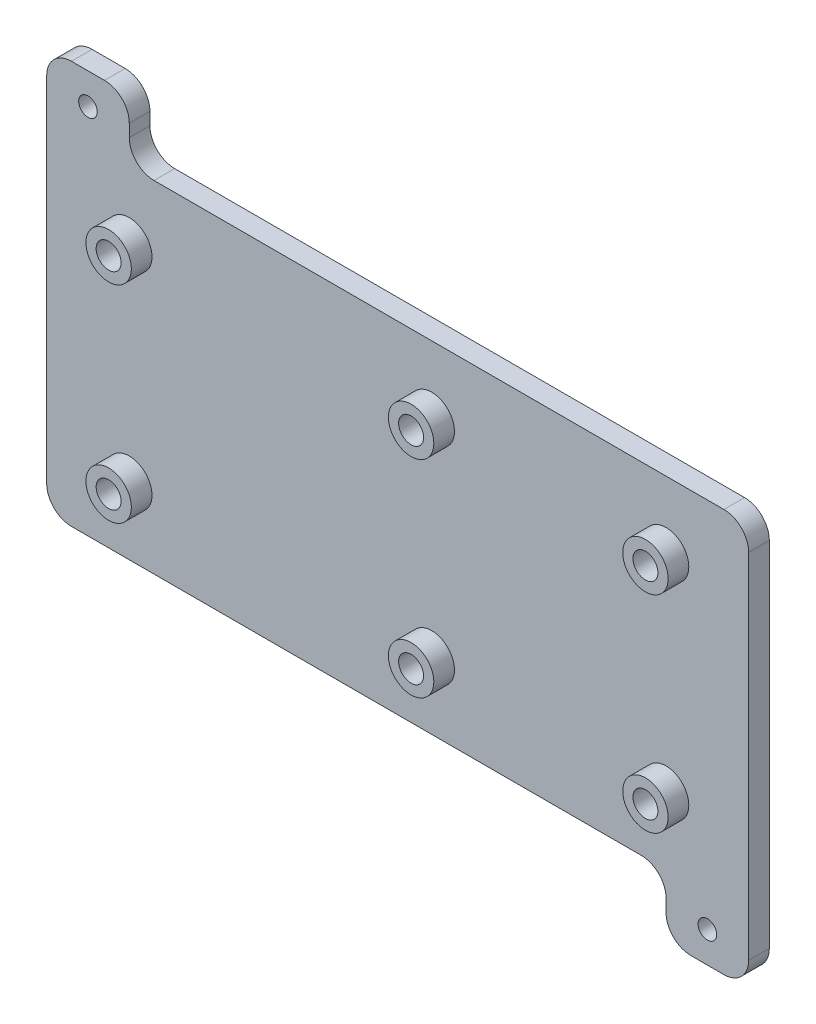
ISO-10303-21;
HEADER;
FILE_DESCRIPTION(('STEP AP214'),'2;1');
FILE_NAME('part.step','',(''),(''),'','','');
FILE_SCHEMA(('AUTOMOTIVE_DESIGN { 1 0 10303 214 1 1 1 1 }'));
ENDSEC;
DATA;
#1=APPLICATION_CONTEXT('core data for automotive mechanical design processes');
#2=APPLICATION_PROTOCOL_DEFINITION('international standard','automotive_design',2000,#1);
#3=PRODUCT_CONTEXT('',#1,'mechanical');
#4=PRODUCT('Part','Part','',(#3));
#5=PRODUCT_RELATED_PRODUCT_CATEGORY('part','',(#4));
#6=PRODUCT_DEFINITION_FORMATION('','',#4);
#7=PRODUCT_DEFINITION_CONTEXT('part definition',#1,'design');
#8=PRODUCT_DEFINITION('design','',#6,#7);
#9=PRODUCT_DEFINITION_SHAPE('','',#8);
#10=(LENGTH_UNIT() NAMED_UNIT(*) SI_UNIT(.MILLI.,.METRE.));
#11=(NAMED_UNIT(*) PLANE_ANGLE_UNIT() SI_UNIT($,.RADIAN.));
#12=(NAMED_UNIT(*) SI_UNIT($,.STERADIAN.) SOLID_ANGLE_UNIT());
#13=UNCERTAINTY_MEASURE_WITH_UNIT(LENGTH_MEASURE(1.E-05),#10,'distance_accuracy_value','');
#14=(GEOMETRIC_REPRESENTATION_CONTEXT(3) GLOBAL_UNCERTAINTY_ASSIGNED_CONTEXT((#13)) GLOBAL_UNIT_ASSIGNED_CONTEXT((#10,
#11,#12)) REPRESENTATION_CONTEXT('',''));
#15=CARTESIAN_POINT('',(0.,0.,0.));
#16=DIRECTION('',(0.,0.,1.));
#17=DIRECTION('',(1.,0.,0.));
#18=AXIS2_PLACEMENT_3D('',#15,#16,#17);
#19=CARTESIAN_POINT('',(85.,41.275,5.));
#20=DIRECTION('',(-1.,0.,0.));
#21=DIRECTION('',(0.,-1.,0.));
#22=AXIS2_PLACEMENT_3D('',#19,#20,#21);
#23=PLANE('',#22);
#24=DIRECTION('',(0.,1.,0.));
#25=VECTOR('',#24,1.);
#26=CARTESIAN_POINT('',(85.,41.275,5.));
#27=LINE('',#26,#25);
#28=CARTESIAN_POINT('',(85.,-50.275,5.));
#29=VERTEX_POINT('',#28);
#30=CARTESIAN_POINT('',(85.,35.275,5.));
#31=VERTEX_POINT('',#30);
#32=EDGE_CURVE('E178',#29,#31,#27,.T.);
#33=ORIENTED_EDGE('',*,*,#32,.F.);
#34=DIRECTION('',(0.,0.,1.));
#35=VECTOR('',#34,1.);
#36=CARTESIAN_POINT('',(85.,-50.275,5.));
#37=LINE('',#36,#35);
#38=CARTESIAN_POINT('',(85.,-50.275,0.));
#39=VERTEX_POINT('',#38);
#40=EDGE_CURVE('E237',#29,#39,#37,.F.);
#41=ORIENTED_EDGE('',*,*,#40,.T.);
#42=DIRECTION('',(0.,1.,0.));
#43=VECTOR('',#42,1.);
#44=CARTESIAN_POINT('',(85.,41.275,0.));
#45=LINE('',#44,#43);
#46=CARTESIAN_POINT('',(85.,35.275,0.));
#47=VERTEX_POINT('',#46);
#48=EDGE_CURVE('E280',#39,#47,#45,.T.);
#49=ORIENTED_EDGE('',*,*,#48,.T.);
#50=DIRECTION('',(0.,0.,-1.));
#51=VECTOR('',#50,1.);
#52=CARTESIAN_POINT('',(85.,35.275,5.));
#53=LINE('',#52,#51);
#54=EDGE_CURVE('E235',#47,#31,#53,.F.);
#55=ORIENTED_EDGE('',*,*,#54,.T.);
#56=EDGE_LOOP('',(#33,#41,#49,#55));
#57=FACE_BOUND('',#56,.T.);
#58=ADVANCED_FACE('F36',(#57),#23,.F.);
#59=CARTESIAN_POINT('',(-85.,41.275,5.));
#60=DIRECTION('',(0.,-1.,0.));
#61=DIRECTION('',(0.,0.,-1.));
#62=AXIS2_PLACEMENT_3D('',#59,#60,#61);
#63=PLANE('',#62);
#64=DIRECTION('',(-1.,0.,0.));
#65=VECTOR('',#64,1.);
#66=CARTESIAN_POINT('',(-85.,41.275,5.));
#67=LINE('',#66,#65);
#68=CARTESIAN_POINT('',(79.,41.275,5.));
#69=VERTEX_POINT('',#68);
#70=CARTESIAN_POINT('',(-59.,41.275,5.));
#71=VERTEX_POINT('',#70);
#72=EDGE_CURVE('E182',#69,#71,#67,.T.);
#73=ORIENTED_EDGE('',*,*,#72,.F.);
#74=DIRECTION('',(0.,0.,-1.));
#75=VECTOR('',#74,1.);
#76=CARTESIAN_POINT('',(79.,41.275,5.));
#77=LINE('',#76,#75);
#78=CARTESIAN_POINT('',(79.,41.275,0.));
#79=VERTEX_POINT('',#78);
#80=EDGE_CURVE('E242',#69,#79,#77,.T.);
#81=ORIENTED_EDGE('',*,*,#80,.T.);
#82=DIRECTION('',(-1.,0.,0.));
#83=VECTOR('',#82,1.);
#84=CARTESIAN_POINT('',(-85.,41.275,0.));
#85=LINE('',#84,#83);
#86=CARTESIAN_POINT('',(-59.,41.275,0.));
#87=VERTEX_POINT('',#86);
#88=EDGE_CURVE('E184',#79,#87,#85,.T.);
#89=ORIENTED_EDGE('',*,*,#88,.T.);
#90=DIRECTION('',(0.,0.,1.));
#91=VECTOR('',#90,1.);
#92=CARTESIAN_POINT('',(-59.,41.275,5.));
#93=LINE('',#92,#91);
#94=EDGE_CURVE('E239',#87,#71,#93,.T.);
#95=ORIENTED_EDGE('',*,*,#94,.T.);
#96=EDGE_LOOP('',(#73,#81,#89,#95));
#97=FACE_BOUND('',#96,.T.);
#98=ADVANCED_FACE('F279',(#97),#63,.F.);
#99=CARTESIAN_POINT('',(-85.,41.275,5.));
#100=DIRECTION('',(1.,0.,0.));
#101=DIRECTION('',(0.,1.,0.));
#102=AXIS2_PLACEMENT_3D('',#99,#100,#101);
#103=PLANE('',#102);
#104=DIRECTION('',(0.,-1.,0.));
#105=VECTOR('',#104,1.);
#106=CARTESIAN_POINT('',(-85.,41.275,5.));
#107=LINE('',#106,#105);
#108=CARTESIAN_POINT('',(-85.,50.275,5.));
#109=VERTEX_POINT('',#108);
#110=CARTESIAN_POINT('',(-85.,-35.275,5.));
#111=VERTEX_POINT('',#110);
#112=EDGE_CURVE('E286',#109,#111,#107,.T.);
#113=ORIENTED_EDGE('',*,*,#112,.F.);
#114=DIRECTION('',(0.,0.,1.));
#115=VECTOR('',#114,1.);
#116=CARTESIAN_POINT('',(-85.,50.275,5.));
#117=LINE('',#116,#115);
#118=CARTESIAN_POINT('',(-85.,50.275,0.));
#119=VERTEX_POINT('',#118);
#120=EDGE_CURVE('E255',#109,#119,#117,.F.);
#121=ORIENTED_EDGE('',*,*,#120,.T.);
#122=DIRECTION('',(0.,-1.,0.));
#123=VECTOR('',#122,1.);
#124=CARTESIAN_POINT('',(-85.,41.275,0.));
#125=LINE('',#124,#123);
#126=CARTESIAN_POINT('',(-85.,-35.275,0.));
#127=VERTEX_POINT('',#126);
#128=EDGE_CURVE('E179',#119,#127,#125,.T.);
#129=ORIENTED_EDGE('',*,*,#128,.T.);
#130=DIRECTION('',(0.,0.,-1.));
#131=VECTOR('',#130,1.);
#132=CARTESIAN_POINT('',(-85.,-35.275,5.));
#133=LINE('',#132,#131);
#134=EDGE_CURVE('E154',#127,#111,#133,.F.);
#135=ORIENTED_EDGE('',*,*,#134,.T.);
#136=EDGE_LOOP('',(#113,#121,#129,#135));
#137=FACE_BOUND('',#136,.T.);
#138=ADVANCED_FACE('F414',(#137),#103,.F.);
#139=CARTESIAN_POINT('',(-85.,-41.275,5.));
#140=DIRECTION('',(0.,1.,0.));
#141=DIRECTION('',(0.,0.,1.));
#142=AXIS2_PLACEMENT_3D('',#139,#140,#141);
#143=PLANE('',#142);
#144=DIRECTION('',(1.,0.,0.));
#145=VECTOR('',#144,1.);
#146=CARTESIAN_POINT('',(-85.,-41.275,0.));
#147=LINE('',#146,#145);
#148=CARTESIAN_POINT('',(-79.,-41.275,0.));
#149=VERTEX_POINT('',#148);
#150=CARTESIAN_POINT('',(59.,-41.275,0.));
#151=VERTEX_POINT('',#150);
#152=EDGE_CURVE('E166',#149,#151,#147,.T.);
#153=ORIENTED_EDGE('',*,*,#152,.T.);
#154=DIRECTION('',(0.,0.,1.));
#155=VECTOR('',#154,1.);
#156=CARTESIAN_POINT('',(59.,-41.275,5.));
#157=LINE('',#156,#155);
#158=CARTESIAN_POINT('',(59.,-41.275,5.));
#159=VERTEX_POINT('',#158);
#160=EDGE_CURVE('E170',#151,#159,#157,.T.);
#161=ORIENTED_EDGE('',*,*,#160,.T.);
#162=DIRECTION('',(1.,0.,0.));
#163=VECTOR('',#162,1.);
#164=CARTESIAN_POINT('',(-85.,-41.275,5.));
#165=LINE('',#164,#163);
#166=CARTESIAN_POINT('',(-79.,-41.275,5.));
#167=VERTEX_POINT('',#166);
#168=EDGE_CURVE('E169',#167,#159,#165,.T.);
#169=ORIENTED_EDGE('',*,*,#168,.F.);
#170=DIRECTION('',(0.,0.,-1.));
#171=VECTOR('',#170,1.);
#172=CARTESIAN_POINT('',(-79.,-41.275,5.));
#173=LINE('',#172,#171);
#174=EDGE_CURVE('E153',#167,#149,#173,.T.);
#175=ORIENTED_EDGE('',*,*,#174,.T.);
#176=EDGE_LOOP('',(#153,#161,#169,#175));
#177=FACE_BOUND('',#176,.T.);
#178=ADVANCED_FACE('F164',(#177),#143,.F.);
#179=CARTESIAN_POINT('',(0.,0.,5.));
#180=DIRECTION('',(0.,0.,1.));
#181=DIRECTION('',(1.,0.,0.));
#182=AXIS2_PLACEMENT_3D('',#179,#180,#181);
#183=PLANE('',#182);
#184=CARTESIAN_POINT('',(-75.,48.775,5.));
#185=DIRECTION('',(0.,0.,1.));
#186=DIRECTION('',(1.,0.,0.));
#187=AXIS2_PLACEMENT_3D('',#184,#185,#186);
#188=CIRCLE('',#187,2.24999999999999);
#189=CARTESIAN_POINT('',(-72.75,48.775,5.));
#190=VERTEX_POINT('',#189);
#191=EDGE_CURVE('E368',#190,#190,#188,.T.);
#192=ORIENTED_EDGE('',*,*,#191,.F.);
#193=EDGE_LOOP('',(#192));
#194=FACE_BOUND('',#193,.T.);
#195=CARTESIAN_POINT('',(75.,-48.775,5.));
#196=DIRECTION('',(0.,0.,1.));
#197=DIRECTION('',(1.,0.,0.));
#198=AXIS2_PLACEMENT_3D('',#195,#196,#197);
#199=CIRCLE('',#198,2.24999999999999);
#200=CARTESIAN_POINT('',(77.25,-48.775,5.));
#201=VERTEX_POINT('',#200);
#202=EDGE_CURVE('E362',#201,#201,#199,.T.);
#203=ORIENTED_EDGE('',*,*,#202,.F.);
#204=EDGE_LOOP('',(#203));
#205=FACE_BOUND('',#204,.T.);
#206=CARTESIAN_POINT('',(65.0000000000003,-25.,5.));
#207=DIRECTION('',(0.,0.,1.));
#208=DIRECTION('',(1.,0.,0.));
#209=AXIS2_PLACEMENT_3D('',#206,#207,#208);
#210=CIRCLE('',#209,5.49999999999954);
#211=CARTESIAN_POINT('',(70.4999999999999,-25.,5.));
#212=VERTEX_POINT('',#211);
#213=EDGE_CURVE('E335',#212,#212,#210,.T.);
#214=ORIENTED_EDGE('',*,*,#213,.F.);
#215=EDGE_LOOP('',(#214));
#216=FACE_BOUND('',#215,.T.);
#217=CARTESIAN_POINT('',(8.25000000000034,-25.,5.));
#218=DIRECTION('',(0.,0.,1.));
#219=DIRECTION('',(1.,0.,0.));
#220=AXIS2_PLACEMENT_3D('',#217,#218,#219);
#221=CIRCLE('',#220,5.49999999999953);
#222=CARTESIAN_POINT('',(13.7499999999999,-25.,5.));
#223=VERTEX_POINT('',#222);
#224=EDGE_CURVE('E326',#223,#223,#221,.T.);
#225=ORIENTED_EDGE('',*,*,#224,.F.);
#226=EDGE_LOOP('',(#225));
#227=FACE_BOUND('',#226,.T.);
#228=CARTESIAN_POINT('',(-64.9999999999997,-25.,5.));
#229=DIRECTION('',(0.,0.,1.));
#230=DIRECTION('',(1.,0.,0.));
#231=AXIS2_PLACEMENT_3D('',#228,#229,#230);
#232=CIRCLE('',#231,5.49999999999953);
#233=CARTESIAN_POINT('',(-59.5000000000002,-25.,5.));
#234=VERTEX_POINT('',#233);
#235=EDGE_CURVE('E317',#234,#234,#232,.T.);
#236=ORIENTED_EDGE('',*,*,#235,.F.);
#237=EDGE_LOOP('',(#236));
#238=FACE_BOUND('',#237,.T.);
#239=CARTESIAN_POINT('',(-64.9999999999997,25.,5.));
#240=DIRECTION('',(0.,0.,1.));
#241=DIRECTION('',(1.,0.,0.));
#242=AXIS2_PLACEMENT_3D('',#239,#240,#241);
#243=CIRCLE('',#242,5.49999999999952);
#244=CARTESIAN_POINT('',(-59.5000000000002,25.,5.));
#245=VERTEX_POINT('',#244);
#246=EDGE_CURVE('E308',#245,#245,#243,.T.);
#247=ORIENTED_EDGE('',*,*,#246,.F.);
#248=EDGE_LOOP('',(#247));
#249=FACE_BOUND('',#248,.T.);
#250=CARTESIAN_POINT('',(8.2500000000003,25.,5.));
#251=DIRECTION('',(0.,0.,1.));
#252=DIRECTION('',(1.,0.,0.));
#253=AXIS2_PLACEMENT_3D('',#250,#251,#252);
#254=CIRCLE('',#253,5.49999999999953);
#255=CARTESIAN_POINT('',(13.7499999999998,25.,5.));
#256=VERTEX_POINT('',#255);
#257=EDGE_CURVE('E299',#256,#256,#254,.T.);
#258=ORIENTED_EDGE('',*,*,#257,.F.);
#259=EDGE_LOOP('',(#258));
#260=FACE_BOUND('',#259,.T.);
#261=CARTESIAN_POINT('',(65.0000000000003,25.,5.));
#262=DIRECTION('',(0.,0.,1.));
#263=DIRECTION('',(1.,0.,0.));
#264=AXIS2_PLACEMENT_3D('',#261,#262,#263);
#265=CIRCLE('',#264,5.49999999999954);
#266=CARTESIAN_POINT('',(70.4999999999998,25.,5.));
#267=VERTEX_POINT('',#266);
#268=EDGE_CURVE('E290',#267,#267,#265,.T.);
#269=ORIENTED_EDGE('',*,*,#268,.F.);
#270=EDGE_LOOP('',(#269));
#271=FACE_BOUND('',#270,.T.);
#272=DIRECTION('',(0.,-1.,0.));
#273=VECTOR('',#272,1.);
#274=CARTESIAN_POINT('',(65.,0.,5.));
#275=LINE('',#274,#273);
#276=CARTESIAN_POINT('',(65.,-47.275,5.));
#277=VERTEX_POINT('',#276);
#278=CARTESIAN_POINT('',(65.,-50.275,5.));
#279=VERTEX_POINT('',#278);
#280=EDGE_CURVE('E354',#277,#279,#275,.T.);
#281=ORIENTED_EDGE('',*,*,#280,.T.);
#282=CARTESIAN_POINT('',(71.,-50.275,5.));
#283=DIRECTION('',(0.,0.,1.));
#284=DIRECTION('',(1.,0.,0.));
#285=AXIS2_PLACEMENT_3D('',#282,#283,#284);
#286=CIRCLE('',#285,6.);
#287=CARTESIAN_POINT('',(71.,-56.275,5.));
#288=VERTEX_POINT('',#287);
#289=EDGE_CURVE('E221',#279,#288,#286,.T.);
#290=ORIENTED_EDGE('',*,*,#289,.T.);
#291=DIRECTION('',(-1.,0.,0.));
#292=VECTOR('',#291,1.);
#293=CARTESIAN_POINT('',(0.,-56.275,5.));
#294=LINE('',#293,#292);
#295=CARTESIAN_POINT('',(79.,-56.275,5.));
#296=VERTEX_POINT('',#295);
#297=EDGE_CURVE('E350',#296,#288,#294,.T.);
#298=ORIENTED_EDGE('',*,*,#297,.F.);
#299=CARTESIAN_POINT('',(79.,-50.275,5.));
#300=DIRECTION('',(0.,0.,1.));
#301=DIRECTION('',(1.,0.,0.));
#302=AXIS2_PLACEMENT_3D('',#299,#300,#301);
#303=CIRCLE('',#302,6.);
#304=EDGE_CURVE('E219',#296,#29,#303,.T.);
#305=ORIENTED_EDGE('',*,*,#304,.T.);
#306=ORIENTED_EDGE('',*,*,#32,.T.);
#307=CARTESIAN_POINT('',(79.,35.275,5.));
#308=DIRECTION('',(0.,0.,1.));
#309=DIRECTION('',(1.,0.,0.));
#310=AXIS2_PLACEMENT_3D('',#307,#308,#309);
#311=CIRCLE('',#310,6.);
#312=EDGE_CURVE('E217',#31,#69,#311,.T.);
#313=ORIENTED_EDGE('',*,*,#312,.T.);
#314=ORIENTED_EDGE('',*,*,#72,.T.);
#315=CARTESIAN_POINT('',(-59.,47.275,5.));
#316=DIRECTION('',(0.,0.,1.));
#317=DIRECTION('',(1.,0.,0.));
#318=AXIS2_PLACEMENT_3D('',#315,#316,#317);
#319=CIRCLE('',#318,6.);
#320=CARTESIAN_POINT('',(-65.,47.275,5.));
#321=VERTEX_POINT('',#320);
#322=EDGE_CURVE('E44',#71,#321,#319,.F.);
#323=ORIENTED_EDGE('',*,*,#322,.T.);
#324=DIRECTION('',(0.,1.,0.));
#325=VECTOR('',#324,1.);
#326=CARTESIAN_POINT('',(-65.,0.,5.));
#327=LINE('',#326,#325);
#328=CARTESIAN_POINT('',(-65.,50.275,5.));
#329=VERTEX_POINT('',#328);
#330=EDGE_CURVE('E265',#321,#329,#327,.T.);
#331=ORIENTED_EDGE('',*,*,#330,.T.);
#332=CARTESIAN_POINT('',(-71.,50.275,5.));
#333=DIRECTION('',(0.,0.,1.));
#334=DIRECTION('',(1.,0.,0.));
#335=AXIS2_PLACEMENT_3D('',#332,#333,#334);
#336=CIRCLE('',#335,6.);
#337=CARTESIAN_POINT('',(-71.,56.275,5.));
#338=VERTEX_POINT('',#337);
#339=EDGE_CURVE('E215',#329,#338,#336,.T.);
#340=ORIENTED_EDGE('',*,*,#339,.T.);
#341=DIRECTION('',(1.,0.,0.));
#342=VECTOR('',#341,1.);
#343=CARTESIAN_POINT('',(0.,56.275,5.));
#344=LINE('',#343,#342);
#345=CARTESIAN_POINT('',(-79.,56.275,5.));
#346=VERTEX_POINT('',#345);
#347=EDGE_CURVE('E274',#346,#338,#344,.T.);
#348=ORIENTED_EDGE('',*,*,#347,.F.);
#349=CARTESIAN_POINT('',(-79.,50.275,5.));
#350=DIRECTION('',(0.,0.,1.));
#351=DIRECTION('',(1.,0.,0.));
#352=AXIS2_PLACEMENT_3D('',#349,#350,#351);
#353=CIRCLE('',#352,6.);
#354=EDGE_CURVE('E213',#346,#109,#353,.T.);
#355=ORIENTED_EDGE('',*,*,#354,.T.);
#356=ORIENTED_EDGE('',*,*,#112,.T.);
#357=CARTESIAN_POINT('',(-79.,-35.275,5.));
#358=DIRECTION('',(0.,0.,1.));
#359=DIRECTION('',(1.,0.,0.));
#360=AXIS2_PLACEMENT_3D('',#357,#358,#359);
#361=CIRCLE('',#360,6.);
#362=EDGE_CURVE('E211',#111,#167,#361,.T.);
#363=ORIENTED_EDGE('',*,*,#362,.T.);
#364=ORIENTED_EDGE('',*,*,#168,.T.);
#365=CARTESIAN_POINT('',(59.,-47.275,5.));
#366=DIRECTION('',(0.,0.,1.));
#367=DIRECTION('',(1.,0.,0.));
#368=AXIS2_PLACEMENT_3D('',#365,#366,#367);
#369=CIRCLE('',#368,6.);
#370=EDGE_CURVE('E257',#159,#277,#369,.F.);
#371=ORIENTED_EDGE('',*,*,#370,.T.);
#372=EDGE_LOOP('',(#281,#290,#298,#305,#306,#313,#314,#323,#331,#340,#348,#355,#356,#363,#364,#371));
#373=FACE_BOUND('',#372,.T.);
#374=ADVANCED_FACE('F264',(#194,#205,#216,#227,#238,#249,#260,#271,#373),#183,.T.);
#375=CARTESIAN_POINT('',(0.,0.,0.));
#376=DIRECTION('',(0.,0.,1.));
#377=DIRECTION('',(1.,0.,0.));
#378=AXIS2_PLACEMENT_3D('',#375,#376,#377);
#379=PLANE('',#378);
#380=CARTESIAN_POINT('',(-75.,48.775,0.));
#381=DIRECTION('',(0.,0.,1.));
#382=DIRECTION('',(1.,0.,0.));
#383=AXIS2_PLACEMENT_3D('',#380,#381,#382);
#384=CIRCLE('',#383,2.24999999999999);
#385=CARTESIAN_POINT('',(-72.75,48.775,0.));
#386=VERTEX_POINT('',#385);
#387=EDGE_CURVE('E365',#386,#386,#384,.T.);
#388=ORIENTED_EDGE('',*,*,#387,.T.);
#389=EDGE_LOOP('',(#388));
#390=FACE_BOUND('',#389,.T.);
#391=CARTESIAN_POINT('',(75.,-48.775,0.));
#392=DIRECTION('',(0.,0.,1.));
#393=DIRECTION('',(1.,0.,0.));
#394=AXIS2_PLACEMENT_3D('',#391,#392,#393);
#395=CIRCLE('',#394,2.24999999999999);
#396=CARTESIAN_POINT('',(77.25,-48.775,0.));
#397=VERTEX_POINT('',#396);
#398=EDGE_CURVE('E356',#397,#397,#395,.T.);
#399=ORIENTED_EDGE('',*,*,#398,.T.);
#400=EDGE_LOOP('',(#399));
#401=FACE_BOUND('',#400,.T.);
#402=DIRECTION('',(-1.,0.,0.));
#403=VECTOR('',#402,1.);
#404=CARTESIAN_POINT('',(0.,-56.275,0.));
#405=LINE('',#404,#403);
#406=CARTESIAN_POINT('',(79.,-56.275,0.));
#407=VERTEX_POINT('',#406);
#408=CARTESIAN_POINT('',(71.,-56.275,0.));
#409=VERTEX_POINT('',#408);
#410=EDGE_CURVE('E275',#407,#409,#405,.T.);
#411=ORIENTED_EDGE('',*,*,#410,.T.);
#412=CARTESIAN_POINT('',(71.,-50.275,0.));
#413=DIRECTION('',(0.,0.,1.));
#414=DIRECTION('',(1.,0.,0.));
#415=AXIS2_PLACEMENT_3D('',#412,#413,#414);
#416=CIRCLE('',#415,6.);
#417=CARTESIAN_POINT('',(65.,-50.275,0.));
#418=VERTEX_POINT('',#417);
#419=EDGE_CURVE('E233',#409,#418,#416,.F.);
#420=ORIENTED_EDGE('',*,*,#419,.T.);
#421=DIRECTION('',(0.,-1.,0.));
#422=VECTOR('',#421,1.);
#423=CARTESIAN_POINT('',(65.,0.,0.));
#424=LINE('',#423,#422);
#425=CARTESIAN_POINT('',(65.,-47.275,0.));
#426=VERTEX_POINT('',#425);
#427=EDGE_CURVE('E353',#426,#418,#424,.T.);
#428=ORIENTED_EDGE('',*,*,#427,.F.);
#429=CARTESIAN_POINT('',(59.,-47.275,0.));
#430=DIRECTION('',(0.,0.,1.));
#431=DIRECTION('',(1.,0.,0.));
#432=AXIS2_PLACEMENT_3D('',#429,#430,#431);
#433=CIRCLE('',#432,6.);
#434=EDGE_CURVE('E177',#426,#151,#433,.T.);
#435=ORIENTED_EDGE('',*,*,#434,.T.);
#436=ORIENTED_EDGE('',*,*,#152,.F.);
#437=CARTESIAN_POINT('',(-79.,-35.275,0.));
#438=DIRECTION('',(0.,0.,1.));
#439=DIRECTION('',(1.,0.,0.));
#440=AXIS2_PLACEMENT_3D('',#437,#438,#439);
#441=CIRCLE('',#440,6.);
#442=EDGE_CURVE('E150',#149,#127,#441,.F.);
#443=ORIENTED_EDGE('',*,*,#442,.T.);
#444=ORIENTED_EDGE('',*,*,#128,.F.);
#445=CARTESIAN_POINT('',(-79.,50.275,0.));
#446=DIRECTION('',(0.,0.,1.));
#447=DIRECTION('',(1.,0.,0.));
#448=AXIS2_PLACEMENT_3D('',#445,#446,#447);
#449=CIRCLE('',#448,6.);
#450=CARTESIAN_POINT('',(-79.,56.275,0.));
#451=VERTEX_POINT('',#450);
#452=EDGE_CURVE('E158',#119,#451,#449,.F.);
#453=ORIENTED_EDGE('',*,*,#452,.T.);
#454=DIRECTION('',(1.,0.,0.));
#455=VECTOR('',#454,1.);
#456=CARTESIAN_POINT('',(0.,56.275,0.));
#457=LINE('',#456,#455);
#458=CARTESIAN_POINT('',(-71.,56.275,0.));
#459=VERTEX_POINT('',#458);
#460=EDGE_CURVE('E343',#451,#459,#457,.T.);
#461=ORIENTED_EDGE('',*,*,#460,.T.);
#462=CARTESIAN_POINT('',(-71.,50.275,0.));
#463=DIRECTION('',(0.,0.,1.));
#464=DIRECTION('',(1.,0.,0.));
#465=AXIS2_PLACEMENT_3D('',#462,#463,#464);
#466=CIRCLE('',#465,6.);
#467=CARTESIAN_POINT('',(-65.,50.275,0.));
#468=VERTEX_POINT('',#467);
#469=EDGE_CURVE('E228',#459,#468,#466,.F.);
#470=ORIENTED_EDGE('',*,*,#469,.T.);
#471=DIRECTION('',(0.,1.,0.));
#472=VECTOR('',#471,1.);
#473=CARTESIAN_POINT('',(-65.,0.,0.));
#474=LINE('',#473,#472);
#475=CARTESIAN_POINT('',(-65.,47.275,0.));
#476=VERTEX_POINT('',#475);
#477=EDGE_CURVE('E345',#476,#468,#474,.T.);
#478=ORIENTED_EDGE('',*,*,#477,.F.);
#479=CARTESIAN_POINT('',(-59.,47.275,0.));
#480=DIRECTION('',(0.,0.,1.));
#481=DIRECTION('',(1.,0.,0.));
#482=AXIS2_PLACEMENT_3D('',#479,#480,#481);
#483=CIRCLE('',#482,6.);
#484=EDGE_CURVE('E11',#476,#87,#483,.T.);
#485=ORIENTED_EDGE('',*,*,#484,.T.);
#486=ORIENTED_EDGE('',*,*,#88,.F.);
#487=CARTESIAN_POINT('',(79.,35.275,0.));
#488=DIRECTION('',(0.,0.,1.));
#489=DIRECTION('',(1.,0.,0.));
#490=AXIS2_PLACEMENT_3D('',#487,#488,#489);
#491=CIRCLE('',#490,6.);
#492=EDGE_CURVE('E57',#79,#47,#491,.F.);
#493=ORIENTED_EDGE('',*,*,#492,.T.);
#494=ORIENTED_EDGE('',*,*,#48,.F.);
#495=CARTESIAN_POINT('',(79.,-50.275,0.));
#496=DIRECTION('',(0.,0.,1.));
#497=DIRECTION('',(1.,0.,0.));
#498=AXIS2_PLACEMENT_3D('',#495,#496,#497);
#499=CIRCLE('',#498,6.);
#500=EDGE_CURVE('E231',#39,#407,#499,.F.);
#501=ORIENTED_EDGE('',*,*,#500,.T.);
#502=EDGE_LOOP('',(#411,#420,#428,#435,#436,#443,#444,#453,#461,#470,#478,#485,#486,#493,#494,#501));
#503=FACE_BOUND('',#502,.T.);
#504=ADVANCED_FACE('F174',(#390,#401,#503),#379,.F.);
#505=CARTESIAN_POINT('',(65.0000000000003,25.,10.));
#506=DIRECTION('',(0.,0.,1.));
#507=DIRECTION('',(1.,0.,0.));
#508=AXIS2_PLACEMENT_3D('',#505,#506,#507);
#509=PLANE('',#508);
#510=CARTESIAN_POINT('',(65.0000000000003,25.,10.));
#511=DIRECTION('',(0.,0.,1.));
#512=DIRECTION('',(1.,0.,0.));
#513=AXIS2_PLACEMENT_3D('',#510,#511,#512);
#514=CIRCLE('',#513,5.49999999999954);
#515=CARTESIAN_POINT('',(70.4999999999998,25.,10.));
#516=VERTEX_POINT('',#515);
#517=EDGE_CURVE('E282',#516,#516,#514,.T.);
#518=ORIENTED_EDGE('',*,*,#517,.T.);
#519=EDGE_LOOP('',(#518));
#520=FACE_BOUND('',#519,.T.);
#521=CARTESIAN_POINT('',(65.0000000000003,25.,10.));
#522=DIRECTION('',(0.,0.,1.));
#523=DIRECTION('',(1.,0.,0.));
#524=AXIS2_PLACEMENT_3D('',#521,#522,#523);
#525=CIRCLE('',#524,3.02499999999954);
#526=CARTESIAN_POINT('',(68.0249999999998,25.,10.));
#527=VERTEX_POINT('',#526);
#528=EDGE_CURVE('E293',#527,#527,#525,.T.);
#529=ORIENTED_EDGE('',*,*,#528,.F.);
#530=EDGE_LOOP('',(#529));
#531=FACE_BOUND('',#530,.T.);
#532=ADVANCED_FACE('F396',(#520,#531),#509,.T.);
#533=CARTESIAN_POINT('',(65.0000000000003,25.,10.));
#534=DIRECTION('',(0.,0.,-1.));
#535=DIRECTION('',(-1.,0.,0.));
#536=AXIS2_PLACEMENT_3D('',#533,#534,#535);
#537=CYLINDRICAL_SURFACE('',#536,5.49999999999954);
#538=ORIENTED_EDGE('',*,*,#517,.F.);
#539=EDGE_LOOP('',(#538));
#540=FACE_BOUND('',#539,.T.);
#541=ORIENTED_EDGE('',*,*,#268,.T.);
#542=EDGE_LOOP('',(#541));
#543=FACE_BOUND('',#542,.T.);
#544=ADVANCED_FACE('F393',(#540,#543),#537,.T.);
#545=CARTESIAN_POINT('',(65.0000000000003,25.,10.));
#546=DIRECTION('',(0.,0.,-1.));
#547=DIRECTION('',(-1.,0.,0.));
#548=AXIS2_PLACEMENT_3D('',#545,#546,#547);
#549=CYLINDRICAL_SURFACE('',#548,3.02499999999954);
#550=ORIENTED_EDGE('',*,*,#528,.T.);
#551=EDGE_LOOP('',(#550));
#552=FACE_BOUND('',#551,.T.);
#553=CARTESIAN_POINT('',(65.0000000000003,25.,5.));
#554=DIRECTION('',(0.,0.,1.));
#555=DIRECTION('',(1.,0.,0.));
#556=AXIS2_PLACEMENT_3D('',#553,#554,#555);
#557=CIRCLE('',#556,3.02499999999954);
#558=CARTESIAN_POINT('',(68.0249999999998,25.,5.));
#559=VERTEX_POINT('',#558);
#560=EDGE_CURVE('E188',#559,#559,#557,.F.);
#561=ORIENTED_EDGE('',*,*,#560,.T.);
#562=EDGE_LOOP('',(#561));
#563=FACE_BOUND('',#562,.T.);
#564=ADVANCED_FACE('F395',(#552,#563),#549,.F.);
#565=ORIENTED_EDGE('',*,*,#560,.F.);
#566=EDGE_LOOP('',(#565));
#567=FACE_BOUND('',#566,.T.);
#568=ADVANCED_FACE('F378',(#567),#183,.T.);
#569=CARTESIAN_POINT('',(8.2500000000003,25.,10.));
#570=DIRECTION('',(0.,0.,1.));
#571=DIRECTION('',(1.,0.,0.));
#572=AXIS2_PLACEMENT_3D('',#569,#570,#571);
#573=PLANE('',#572);
#574=CARTESIAN_POINT('',(8.2500000000003,25.,10.));
#575=DIRECTION('',(0.,0.,1.));
#576=DIRECTION('',(1.,0.,0.));
#577=AXIS2_PLACEMENT_3D('',#574,#575,#576);
#578=CIRCLE('',#577,5.49999999999953);
#579=CARTESIAN_POINT('',(13.7499999999998,25.,10.));
#580=VERTEX_POINT('',#579);
#581=EDGE_CURVE('E298',#580,#580,#578,.T.);
#582=ORIENTED_EDGE('',*,*,#581,.T.);
#583=EDGE_LOOP('',(#582));
#584=FACE_BOUND('',#583,.T.);
#585=CARTESIAN_POINT('',(8.2500000000003,25.,10.));
#586=DIRECTION('',(0.,0.,1.));
#587=DIRECTION('',(1.,0.,0.));
#588=AXIS2_PLACEMENT_3D('',#585,#586,#587);
#589=CIRCLE('',#588,3.02499999999953);
#590=CARTESIAN_POINT('',(11.2749999999998,25.,10.));
#591=VERTEX_POINT('',#590);
#592=EDGE_CURVE('E302',#591,#591,#589,.T.);
#593=ORIENTED_EDGE('',*,*,#592,.F.);
#594=EDGE_LOOP('',(#593));
#595=FACE_BOUND('',#594,.T.);
#596=ADVANCED_FACE('F549',(#584,#595),#573,.T.);
#597=CARTESIAN_POINT('',(8.2500000000003,25.,10.));
#598=DIRECTION('',(0.,0.,-1.));
#599=DIRECTION('',(-1.,0.,0.));
#600=AXIS2_PLACEMENT_3D('',#597,#598,#599);
#601=CYLINDRICAL_SURFACE('',#600,5.49999999999953);
#602=ORIENTED_EDGE('',*,*,#581,.F.);
#603=EDGE_LOOP('',(#602));
#604=FACE_BOUND('',#603,.T.);
#605=ORIENTED_EDGE('',*,*,#257,.T.);
#606=EDGE_LOOP('',(#605));
#607=FACE_BOUND('',#606,.T.);
#608=ADVANCED_FACE('F547',(#604,#607),#601,.T.);
#609=CARTESIAN_POINT('',(8.2500000000003,25.,10.));
#610=DIRECTION('',(0.,0.,-1.));
#611=DIRECTION('',(-1.,0.,0.));
#612=AXIS2_PLACEMENT_3D('',#609,#610,#611);
#613=CYLINDRICAL_SURFACE('',#612,3.02499999999953);
#614=ORIENTED_EDGE('',*,*,#592,.T.);
#615=EDGE_LOOP('',(#614));
#616=FACE_BOUND('',#615,.T.);
#617=CARTESIAN_POINT('',(8.2500000000003,25.,5.));
#618=DIRECTION('',(0.,0.,1.));
#619=DIRECTION('',(1.,0.,0.));
#620=AXIS2_PLACEMENT_3D('',#617,#618,#619);
#621=CIRCLE('',#620,3.02499999999953);
#622=CARTESIAN_POINT('',(11.2749999999998,25.,5.));
#623=VERTEX_POINT('',#622);
#624=EDGE_CURVE('E191',#623,#623,#621,.F.);
#625=ORIENTED_EDGE('',*,*,#624,.T.);
#626=EDGE_LOOP('',(#625));
#627=FACE_BOUND('',#626,.T.);
#628=ADVANCED_FACE('F544',(#616,#627),#613,.F.);
#629=ORIENTED_EDGE('',*,*,#624,.F.);
#630=EDGE_LOOP('',(#629));
#631=FACE_BOUND('',#630,.T.);
#632=ADVANCED_FACE('F539',(#631),#183,.T.);
#633=CARTESIAN_POINT('',(-64.9999999999997,25.,10.));
#634=DIRECTION('',(0.,0.,1.));
#635=DIRECTION('',(1.,0.,0.));
#636=AXIS2_PLACEMENT_3D('',#633,#634,#635);
#637=PLANE('',#636);
#638=CARTESIAN_POINT('',(-64.9999999999997,25.,10.));
#639=DIRECTION('',(0.,0.,1.));
#640=DIRECTION('',(1.,0.,0.));
#641=AXIS2_PLACEMENT_3D('',#638,#639,#640);
#642=CIRCLE('',#641,5.49999999999952);
#643=CARTESIAN_POINT('',(-59.5000000000002,25.,10.));
#644=VERTEX_POINT('',#643);
#645=EDGE_CURVE('E307',#644,#644,#642,.T.);
#646=ORIENTED_EDGE('',*,*,#645,.T.);
#647=EDGE_LOOP('',(#646));
#648=FACE_BOUND('',#647,.T.);
#649=CARTESIAN_POINT('',(-64.9999999999997,25.,10.));
#650=DIRECTION('',(0.,0.,1.));
#651=DIRECTION('',(1.,0.,0.));
#652=AXIS2_PLACEMENT_3D('',#649,#650,#651);
#653=CIRCLE('',#652,3.02499999999953);
#654=CARTESIAN_POINT('',(-61.9750000000002,25.,10.));
#655=VERTEX_POINT('',#654);
#656=EDGE_CURVE('E311',#655,#655,#653,.T.);
#657=ORIENTED_EDGE('',*,*,#656,.F.);
#658=EDGE_LOOP('',(#657));
#659=FACE_BOUND('',#658,.T.);
#660=ADVANCED_FACE('F536',(#648,#659),#637,.T.);
#661=CARTESIAN_POINT('',(-64.9999999999997,25.,10.));
#662=DIRECTION('',(0.,0.,-1.));
#663=DIRECTION('',(-1.,0.,0.));
#664=AXIS2_PLACEMENT_3D('',#661,#662,#663);
#665=CYLINDRICAL_SURFACE('',#664,5.49999999999952);
#666=ORIENTED_EDGE('',*,*,#645,.F.);
#667=EDGE_LOOP('',(#666));
#668=FACE_BOUND('',#667,.T.);
#669=ORIENTED_EDGE('',*,*,#246,.T.);
#670=EDGE_LOOP('',(#669));
#671=FACE_BOUND('',#670,.T.);
#672=ADVANCED_FACE('F534',(#668,#671),#665,.T.);
#673=CARTESIAN_POINT('',(-64.9999999999997,25.,10.));
#674=DIRECTION('',(0.,0.,-1.));
#675=DIRECTION('',(-1.,0.,0.));
#676=AXIS2_PLACEMENT_3D('',#673,#674,#675);
#677=CYLINDRICAL_SURFACE('',#676,3.02499999999953);
#678=ORIENTED_EDGE('',*,*,#656,.T.);
#679=EDGE_LOOP('',(#678));
#680=FACE_BOUND('',#679,.T.);
#681=CARTESIAN_POINT('',(-64.9999999999997,25.,5.));
#682=DIRECTION('',(0.,0.,1.));
#683=DIRECTION('',(1.,0.,0.));
#684=AXIS2_PLACEMENT_3D('',#681,#682,#683);
#685=CIRCLE('',#684,3.02499999999953);
#686=CARTESIAN_POINT('',(-61.9750000000002,25.,5.));
#687=VERTEX_POINT('',#686);
#688=EDGE_CURVE('E194',#687,#687,#685,.F.);
#689=ORIENTED_EDGE('',*,*,#688,.T.);
#690=EDGE_LOOP('',(#689));
#691=FACE_BOUND('',#690,.T.);
#692=ADVANCED_FACE('F531',(#680,#691),#677,.F.);
#693=ORIENTED_EDGE('',*,*,#688,.F.);
#694=EDGE_LOOP('',(#693));
#695=FACE_BOUND('',#694,.T.);
#696=ADVANCED_FACE('F526',(#695),#183,.T.);
#697=CARTESIAN_POINT('',(-64.9999999999997,-25.,10.));
#698=DIRECTION('',(0.,0.,1.));
#699=DIRECTION('',(1.,0.,0.));
#700=AXIS2_PLACEMENT_3D('',#697,#698,#699);
#701=PLANE('',#700);
#702=CARTESIAN_POINT('',(-64.9999999999997,-25.,10.));
#703=DIRECTION('',(0.,0.,1.));
#704=DIRECTION('',(1.,0.,0.));
#705=AXIS2_PLACEMENT_3D('',#702,#703,#704);
#706=CIRCLE('',#705,5.49999999999953);
#707=CARTESIAN_POINT('',(-59.5000000000002,-25.,10.));
#708=VERTEX_POINT('',#707);
#709=EDGE_CURVE('E316',#708,#708,#706,.T.);
#710=ORIENTED_EDGE('',*,*,#709,.T.);
#711=EDGE_LOOP('',(#710));
#712=FACE_BOUND('',#711,.T.);
#713=CARTESIAN_POINT('',(-64.9999999999997,-25.,10.));
#714=DIRECTION('',(0.,0.,1.));
#715=DIRECTION('',(1.,0.,0.));
#716=AXIS2_PLACEMENT_3D('',#713,#714,#715);
#717=CIRCLE('',#716,3.02499999999954);
#718=CARTESIAN_POINT('',(-61.9750000000002,-25.,10.));
#719=VERTEX_POINT('',#718);
#720=EDGE_CURVE('E320',#719,#719,#717,.T.);
#721=ORIENTED_EDGE('',*,*,#720,.F.);
#722=EDGE_LOOP('',(#721));
#723=FACE_BOUND('',#722,.T.);
#724=ADVANCED_FACE('F523',(#712,#723),#701,.T.);
#725=CARTESIAN_POINT('',(-64.9999999999997,-25.,10.));
#726=DIRECTION('',(0.,0.,-1.));
#727=DIRECTION('',(-1.,0.,0.));
#728=AXIS2_PLACEMENT_3D('',#725,#726,#727);
#729=CYLINDRICAL_SURFACE('',#728,5.49999999999953);
#730=ORIENTED_EDGE('',*,*,#709,.F.);
#731=EDGE_LOOP('',(#730));
#732=FACE_BOUND('',#731,.T.);
#733=ORIENTED_EDGE('',*,*,#235,.T.);
#734=EDGE_LOOP('',(#733));
#735=FACE_BOUND('',#734,.T.);
#736=ADVANCED_FACE('F521',(#732,#735),#729,.T.);
#737=CARTESIAN_POINT('',(-64.9999999999997,-25.,10.));
#738=DIRECTION('',(0.,0.,-1.));
#739=DIRECTION('',(-1.,0.,0.));
#740=AXIS2_PLACEMENT_3D('',#737,#738,#739);
#741=CYLINDRICAL_SURFACE('',#740,3.02499999999954);
#742=ORIENTED_EDGE('',*,*,#720,.T.);
#743=EDGE_LOOP('',(#742));
#744=FACE_BOUND('',#743,.T.);
#745=CARTESIAN_POINT('',(-64.9999999999997,-25.,5.));
#746=DIRECTION('',(0.,0.,1.));
#747=DIRECTION('',(1.,0.,0.));
#748=AXIS2_PLACEMENT_3D('',#745,#746,#747);
#749=CIRCLE('',#748,3.02499999999954);
#750=CARTESIAN_POINT('',(-61.9750000000002,-25.,5.));
#751=VERTEX_POINT('',#750);
#752=EDGE_CURVE('E197',#751,#751,#749,.F.);
#753=ORIENTED_EDGE('',*,*,#752,.T.);
#754=EDGE_LOOP('',(#753));
#755=FACE_BOUND('',#754,.T.);
#756=ADVANCED_FACE('F518',(#744,#755),#741,.F.);
#757=ORIENTED_EDGE('',*,*,#752,.F.);
#758=EDGE_LOOP('',(#757));
#759=FACE_BOUND('',#758,.T.);
#760=ADVANCED_FACE('F513',(#759),#183,.T.);
#761=CARTESIAN_POINT('',(8.25000000000034,-25.,10.));
#762=DIRECTION('',(0.,0.,1.));
#763=DIRECTION('',(1.,0.,0.));
#764=AXIS2_PLACEMENT_3D('',#761,#762,#763);
#765=PLANE('',#764);
#766=CARTESIAN_POINT('',(8.25000000000034,-25.,10.));
#767=DIRECTION('',(0.,0.,1.));
#768=DIRECTION('',(1.,0.,0.));
#769=AXIS2_PLACEMENT_3D('',#766,#767,#768);
#770=CIRCLE('',#769,5.49999999999953);
#771=CARTESIAN_POINT('',(13.7499999999999,-25.,10.));
#772=VERTEX_POINT('',#771);
#773=EDGE_CURVE('E325',#772,#772,#770,.T.);
#774=ORIENTED_EDGE('',*,*,#773,.T.);
#775=EDGE_LOOP('',(#774));
#776=FACE_BOUND('',#775,.T.);
#777=CARTESIAN_POINT('',(8.25000000000034,-25.,10.));
#778=DIRECTION('',(0.,0.,1.));
#779=DIRECTION('',(1.,0.,0.));
#780=AXIS2_PLACEMENT_3D('',#777,#778,#779);
#781=CIRCLE('',#780,3.02499999999953);
#782=CARTESIAN_POINT('',(11.2749999999999,-25.,10.));
#783=VERTEX_POINT('',#782);
#784=EDGE_CURVE('E329',#783,#783,#781,.T.);
#785=ORIENTED_EDGE('',*,*,#784,.F.);
#786=EDGE_LOOP('',(#785));
#787=FACE_BOUND('',#786,.T.);
#788=ADVANCED_FACE('F510',(#776,#787),#765,.T.);
#789=CARTESIAN_POINT('',(8.25000000000034,-25.,10.));
#790=DIRECTION('',(0.,0.,-1.));
#791=DIRECTION('',(-1.,0.,0.));
#792=AXIS2_PLACEMENT_3D('',#789,#790,#791);
#793=CYLINDRICAL_SURFACE('',#792,5.49999999999953);
#794=ORIENTED_EDGE('',*,*,#773,.F.);
#795=EDGE_LOOP('',(#794));
#796=FACE_BOUND('',#795,.T.);
#797=ORIENTED_EDGE('',*,*,#224,.T.);
#798=EDGE_LOOP('',(#797));
#799=FACE_BOUND('',#798,.T.);
#800=ADVANCED_FACE('F508',(#796,#799),#793,.T.);
#801=CARTESIAN_POINT('',(8.25000000000034,-25.,10.));
#802=DIRECTION('',(0.,0.,-1.));
#803=DIRECTION('',(-1.,0.,0.));
#804=AXIS2_PLACEMENT_3D('',#801,#802,#803);
#805=CYLINDRICAL_SURFACE('',#804,3.02499999999953);
#806=ORIENTED_EDGE('',*,*,#784,.T.);
#807=EDGE_LOOP('',(#806));
#808=FACE_BOUND('',#807,.T.);
#809=CARTESIAN_POINT('',(8.25000000000034,-25.,5.));
#810=DIRECTION('',(0.,0.,1.));
#811=DIRECTION('',(1.,0.,0.));
#812=AXIS2_PLACEMENT_3D('',#809,#810,#811);
#813=CIRCLE('',#812,3.02499999999953);
#814=CARTESIAN_POINT('',(11.2749999999999,-25.,5.));
#815=VERTEX_POINT('',#814);
#816=EDGE_CURVE('E200',#815,#815,#813,.F.);
#817=ORIENTED_EDGE('',*,*,#816,.T.);
#818=EDGE_LOOP('',(#817));
#819=FACE_BOUND('',#818,.T.);
#820=ADVANCED_FACE('F505',(#808,#819),#805,.F.);
#821=ORIENTED_EDGE('',*,*,#816,.F.);
#822=EDGE_LOOP('',(#821));
#823=FACE_BOUND('',#822,.T.);
#824=ADVANCED_FACE('F500',(#823),#183,.T.);
#825=CARTESIAN_POINT('',(65.0000000000003,-25.,10.));
#826=DIRECTION('',(0.,0.,1.));
#827=DIRECTION('',(1.,0.,0.));
#828=AXIS2_PLACEMENT_3D('',#825,#826,#827);
#829=PLANE('',#828);
#830=CARTESIAN_POINT('',(65.0000000000003,-25.,10.));
#831=DIRECTION('',(0.,0.,1.));
#832=DIRECTION('',(1.,0.,0.));
#833=AXIS2_PLACEMENT_3D('',#830,#831,#832);
#834=CIRCLE('',#833,5.49999999999954);
#835=CARTESIAN_POINT('',(70.4999999999999,-25.,10.));
#836=VERTEX_POINT('',#835);
#837=EDGE_CURVE('E334',#836,#836,#834,.T.);
#838=ORIENTED_EDGE('',*,*,#837,.T.);
#839=EDGE_LOOP('',(#838));
#840=FACE_BOUND('',#839,.T.);
#841=CARTESIAN_POINT('',(65.0000000000003,-25.,10.));
#842=DIRECTION('',(0.,0.,1.));
#843=DIRECTION('',(1.,0.,0.));
#844=AXIS2_PLACEMENT_3D('',#841,#842,#843);
#845=CIRCLE('',#844,3.02499999999954);
#846=CARTESIAN_POINT('',(68.0249999999998,-25.,10.));
#847=VERTEX_POINT('',#846);
#848=EDGE_CURVE('E338',#847,#847,#845,.T.);
#849=ORIENTED_EDGE('',*,*,#848,.F.);
#850=EDGE_LOOP('',(#849));
#851=FACE_BOUND('',#850,.T.);
#852=ADVANCED_FACE('F497',(#840,#851),#829,.T.);
#853=CARTESIAN_POINT('',(65.0000000000003,-25.,10.));
#854=DIRECTION('',(0.,0.,-1.));
#855=DIRECTION('',(-1.,0.,0.));
#856=AXIS2_PLACEMENT_3D('',#853,#854,#855);
#857=CYLINDRICAL_SURFACE('',#856,5.49999999999954);
#858=ORIENTED_EDGE('',*,*,#837,.F.);
#859=EDGE_LOOP('',(#858));
#860=FACE_BOUND('',#859,.T.);
#861=ORIENTED_EDGE('',*,*,#213,.T.);
#862=EDGE_LOOP('',(#861));
#863=FACE_BOUND('',#862,.T.);
#864=ADVANCED_FACE('F495',(#860,#863),#857,.T.);
#865=CARTESIAN_POINT('',(65.0000000000003,-25.,10.));
#866=DIRECTION('',(0.,0.,-1.));
#867=DIRECTION('',(-1.,0.,0.));
#868=AXIS2_PLACEMENT_3D('',#865,#866,#867);
#869=CYLINDRICAL_SURFACE('',#868,3.02499999999954);
#870=ORIENTED_EDGE('',*,*,#848,.T.);
#871=EDGE_LOOP('',(#870));
#872=FACE_BOUND('',#871,.T.);
#873=CARTESIAN_POINT('',(65.0000000000003,-25.,5.));
#874=DIRECTION('',(0.,0.,1.));
#875=DIRECTION('',(1.,0.,0.));
#876=AXIS2_PLACEMENT_3D('',#873,#874,#875);
#877=CIRCLE('',#876,3.02499999999954);
#878=CARTESIAN_POINT('',(68.0249999999998,-25.,5.));
#879=VERTEX_POINT('',#878);
#880=EDGE_CURVE('E171',#879,#879,#877,.F.);
#881=ORIENTED_EDGE('',*,*,#880,.T.);
#882=EDGE_LOOP('',(#881));
#883=FACE_BOUND('',#882,.T.);
#884=ADVANCED_FACE('F492',(#872,#883),#869,.F.);
#885=ORIENTED_EDGE('',*,*,#880,.F.);
#886=EDGE_LOOP('',(#885));
#887=FACE_BOUND('',#886,.T.);
#888=ADVANCED_FACE('F377',(#887),#183,.T.);
#889=CARTESIAN_POINT('',(0.,56.275,0.));
#890=DIRECTION('',(0.,-1.,0.));
#891=DIRECTION('',(0.,0.,-1.));
#892=AXIS2_PLACEMENT_3D('',#889,#890,#891);
#893=PLANE('',#892);
#894=ORIENTED_EDGE('',*,*,#347,.T.);
#895=DIRECTION('',(0.,0.,1.));
#896=VECTOR('',#895,1.);
#897=CARTESIAN_POINT('',(-71.,56.275,0.));
#898=LINE('',#897,#896);
#899=EDGE_CURVE('E252',#338,#459,#898,.F.);
#900=ORIENTED_EDGE('',*,*,#899,.T.);
#901=ORIENTED_EDGE('',*,*,#460,.F.);
#902=DIRECTION('',(0.,0.,1.));
#903=VECTOR('',#902,1.);
#904=CARTESIAN_POINT('',(-79.,56.275,0.));
#905=LINE('',#904,#903);
#906=EDGE_CURVE('E249',#451,#346,#905,.T.);
#907=ORIENTED_EDGE('',*,*,#906,.T.);
#908=EDGE_LOOP('',(#894,#900,#901,#907));
#909=FACE_BOUND('',#908,.T.);
#910=ADVANCED_FACE('F453',(#909),#893,.F.);
#911=CARTESIAN_POINT('',(-65.,0.,0.));
#912=DIRECTION('',(1.,0.,0.));
#913=DIRECTION('',(0.,0.,-1.));
#914=AXIS2_PLACEMENT_3D('',#911,#912,#913);
#915=PLANE('',#914);
#916=ORIENTED_EDGE('',*,*,#330,.F.);
#917=DIRECTION('',(0.,0.,1.));
#918=VECTOR('',#917,1.);
#919=CARTESIAN_POINT('',(-65.,47.275,0.));
#920=LINE('',#919,#918);
#921=EDGE_CURVE('E247',#321,#476,#920,.F.);
#922=ORIENTED_EDGE('',*,*,#921,.T.);
#923=ORIENTED_EDGE('',*,*,#477,.T.);
#924=DIRECTION('',(0.,0.,1.));
#925=VECTOR('',#924,1.);
#926=CARTESIAN_POINT('',(-65.,50.275,5.));
#927=LINE('',#926,#925);
#928=EDGE_CURVE('E244',#468,#329,#927,.T.);
#929=ORIENTED_EDGE('',*,*,#928,.T.);
#930=EDGE_LOOP('',(#916,#922,#923,#929));
#931=FACE_BOUND('',#930,.T.);
#932=ADVANCED_FACE('F271',(#931),#915,.T.);
#933=CARTESIAN_POINT('',(65.,0.,0.));
#934=DIRECTION('',(-1.,0.,0.));
#935=DIRECTION('',(0.,0.,1.));
#936=AXIS2_PLACEMENT_3D('',#933,#934,#935);
#937=PLANE('',#936);
#938=ORIENTED_EDGE('',*,*,#280,.F.);
#939=DIRECTION('',(0.,0.,1.));
#940=VECTOR('',#939,1.);
#941=CARTESIAN_POINT('',(65.,-47.275,0.));
#942=LINE('',#941,#940);
#943=EDGE_CURVE('E209',#277,#426,#942,.F.);
#944=ORIENTED_EDGE('',*,*,#943,.T.);
#945=ORIENTED_EDGE('',*,*,#427,.T.);
#946=DIRECTION('',(0.,0.,1.));
#947=VECTOR('',#946,1.);
#948=CARTESIAN_POINT('',(65.,-50.275,5.));
#949=LINE('',#948,#947);
#950=EDGE_CURVE('E206',#418,#279,#949,.T.);
#951=ORIENTED_EDGE('',*,*,#950,.T.);
#952=EDGE_LOOP('',(#938,#944,#945,#951));
#953=FACE_BOUND('',#952,.T.);
#954=ADVANCED_FACE('F483',(#953),#937,.T.);
#955=CARTESIAN_POINT('',(0.,-56.275,0.));
#956=DIRECTION('',(0.,1.,0.));
#957=DIRECTION('',(0.,0.,1.));
#958=AXIS2_PLACEMENT_3D('',#955,#956,#957);
#959=PLANE('',#958);
#960=ORIENTED_EDGE('',*,*,#297,.T.);
#961=DIRECTION('',(0.,0.,1.));
#962=VECTOR('',#961,1.);
#963=CARTESIAN_POINT('',(71.,-56.275,0.));
#964=LINE('',#963,#962);
#965=EDGE_CURVE('E159',#288,#409,#964,.F.);
#966=ORIENTED_EDGE('',*,*,#965,.T.);
#967=ORIENTED_EDGE('',*,*,#410,.F.);
#968=DIRECTION('',(0.,0.,1.));
#969=VECTOR('',#968,1.);
#970=CARTESIAN_POINT('',(79.,-56.275,0.));
#971=LINE('',#970,#969);
#972=EDGE_CURVE('E223',#407,#296,#971,.T.);
#973=ORIENTED_EDGE('',*,*,#972,.T.);
#974=EDGE_LOOP('',(#960,#966,#967,#973));
#975=FACE_BOUND('',#974,.T.);
#976=ADVANCED_FACE('F423',(#975),#959,.F.);
#977=CARTESIAN_POINT('',(59.,-47.275,5.));
#978=DIRECTION('',(0.,0.,1.));
#979=DIRECTION('',(1.,0.,0.));
#980=AXIS2_PLACEMENT_3D('',#977,#978,#979);
#981=CYLINDRICAL_SURFACE('',#980,6.);
#982=ORIENTED_EDGE('',*,*,#434,.F.);
#983=ORIENTED_EDGE('',*,*,#943,.F.);
#984=ORIENTED_EDGE('',*,*,#370,.F.);
#985=ORIENTED_EDGE('',*,*,#160,.F.);
#986=EDGE_LOOP('',(#982,#983,#984,#985));
#987=FACE_BOUND('',#986,.T.);
#988=ADVANCED_FACE('F419',(#987),#981,.F.);
#989=CARTESIAN_POINT('',(71.,-50.275,0.));
#990=DIRECTION('',(0.,0.,-1.));
#991=DIRECTION('',(-1.,0.,0.));
#992=AXIS2_PLACEMENT_3D('',#989,#990,#991);
#993=CYLINDRICAL_SURFACE('',#992,6.);
#994=ORIENTED_EDGE('',*,*,#419,.F.);
#995=ORIENTED_EDGE('',*,*,#965,.F.);
#996=ORIENTED_EDGE('',*,*,#289,.F.);
#997=ORIENTED_EDGE('',*,*,#950,.F.);
#998=EDGE_LOOP('',(#994,#995,#996,#997));
#999=FACE_BOUND('',#998,.T.);
#1000=ADVANCED_FACE('F422',(#999),#993,.T.);
#1001=CARTESIAN_POINT('',(79.,-50.275,0.));
#1002=DIRECTION('',(0.,0.,1.));
#1003=DIRECTION('',(1.,0.,0.));
#1004=AXIS2_PLACEMENT_3D('',#1001,#1002,#1003);
#1005=CYLINDRICAL_SURFACE('',#1004,6.);
#1006=ORIENTED_EDGE('',*,*,#500,.F.);
#1007=ORIENTED_EDGE('',*,*,#40,.F.);
#1008=ORIENTED_EDGE('',*,*,#304,.F.);
#1009=ORIENTED_EDGE('',*,*,#972,.F.);
#1010=EDGE_LOOP('',(#1006,#1007,#1008,#1009));
#1011=FACE_BOUND('',#1010,.T.);
#1012=ADVANCED_FACE('F427',(#1011),#1005,.T.);
#1013=CARTESIAN_POINT('',(79.,35.275,5.));
#1014=DIRECTION('',(0.,0.,-1.));
#1015=DIRECTION('',(-1.,0.,0.));
#1016=AXIS2_PLACEMENT_3D('',#1013,#1014,#1015);
#1017=CYLINDRICAL_SURFACE('',#1016,6.);
#1018=ORIENTED_EDGE('',*,*,#312,.F.);
#1019=ORIENTED_EDGE('',*,*,#54,.F.);
#1020=ORIENTED_EDGE('',*,*,#492,.F.);
#1021=ORIENTED_EDGE('',*,*,#80,.F.);
#1022=EDGE_LOOP('',(#1018,#1019,#1020,#1021));
#1023=FACE_BOUND('',#1022,.T.);
#1024=ADVANCED_FACE('F431',(#1023),#1017,.T.);
#1025=CARTESIAN_POINT('',(-59.,47.275,5.));
#1026=DIRECTION('',(0.,0.,1.));
#1027=DIRECTION('',(1.,0.,0.));
#1028=AXIS2_PLACEMENT_3D('',#1025,#1026,#1027);
#1029=CYLINDRICAL_SURFACE('',#1028,6.);
#1030=ORIENTED_EDGE('',*,*,#484,.F.);
#1031=ORIENTED_EDGE('',*,*,#921,.F.);
#1032=ORIENTED_EDGE('',*,*,#322,.F.);
#1033=ORIENTED_EDGE('',*,*,#94,.F.);
#1034=EDGE_LOOP('',(#1030,#1031,#1032,#1033));
#1035=FACE_BOUND('',#1034,.T.);
#1036=ADVANCED_FACE('F277',(#1035),#1029,.F.);
#1037=CARTESIAN_POINT('',(-71.,50.275,0.));
#1038=DIRECTION('',(0.,0.,-1.));
#1039=DIRECTION('',(-1.,0.,0.));
#1040=AXIS2_PLACEMENT_3D('',#1037,#1038,#1039);
#1041=CYLINDRICAL_SURFACE('',#1040,6.);
#1042=ORIENTED_EDGE('',*,*,#469,.F.);
#1043=ORIENTED_EDGE('',*,*,#899,.F.);
#1044=ORIENTED_EDGE('',*,*,#339,.F.);
#1045=ORIENTED_EDGE('',*,*,#928,.F.);
#1046=EDGE_LOOP('',(#1042,#1043,#1044,#1045));
#1047=FACE_BOUND('',#1046,.T.);
#1048=ADVANCED_FACE('F437',(#1047),#1041,.T.);
#1049=CARTESIAN_POINT('',(-79.,50.275,0.));
#1050=DIRECTION('',(0.,0.,1.));
#1051=DIRECTION('',(1.,0.,0.));
#1052=AXIS2_PLACEMENT_3D('',#1049,#1050,#1051);
#1053=CYLINDRICAL_SURFACE('',#1052,6.);
#1054=ORIENTED_EDGE('',*,*,#452,.F.);
#1055=ORIENTED_EDGE('',*,*,#120,.F.);
#1056=ORIENTED_EDGE('',*,*,#354,.F.);
#1057=ORIENTED_EDGE('',*,*,#906,.F.);
#1058=EDGE_LOOP('',(#1054,#1055,#1056,#1057));
#1059=FACE_BOUND('',#1058,.T.);
#1060=ADVANCED_FACE('F439',(#1059),#1053,.T.);
#1061=CARTESIAN_POINT('',(-79.,-35.275,5.));
#1062=DIRECTION('',(0.,0.,-1.));
#1063=DIRECTION('',(-1.,0.,0.));
#1064=AXIS2_PLACEMENT_3D('',#1061,#1062,#1063);
#1065=CYLINDRICAL_SURFACE('',#1064,6.);
#1066=ORIENTED_EDGE('',*,*,#362,.F.);
#1067=ORIENTED_EDGE('',*,*,#134,.F.);
#1068=ORIENTED_EDGE('',*,*,#442,.F.);
#1069=ORIENTED_EDGE('',*,*,#174,.F.);
#1070=EDGE_LOOP('',(#1066,#1067,#1068,#1069));
#1071=FACE_BOUND('',#1070,.T.);
#1072=ADVANCED_FACE('F38',(#1071),#1065,.T.);
#1073=CARTESIAN_POINT('',(75.,-48.775,5.));
#1074=DIRECTION('',(0.,0.,1.));
#1075=DIRECTION('',(1.,0.,0.));
#1076=AXIS2_PLACEMENT_3D('',#1073,#1074,#1075);
#1077=CYLINDRICAL_SURFACE('',#1076,2.24999999999999);
#1078=ORIENTED_EDGE('',*,*,#398,.F.);
#1079=EDGE_LOOP('',(#1078));
#1080=FACE_BOUND('',#1079,.T.);
#1081=ORIENTED_EDGE('',*,*,#202,.T.);
#1082=EDGE_LOOP('',(#1081));
#1083=FACE_BOUND('',#1082,.T.);
#1084=ADVANCED_FACE('F446',(#1080,#1083),#1077,.F.);
#1085=CARTESIAN_POINT('',(-75.,48.775,5.));
#1086=DIRECTION('',(0.,0.,1.));
#1087=DIRECTION('',(1.,0.,0.));
#1088=AXIS2_PLACEMENT_3D('',#1085,#1086,#1087);
#1089=CYLINDRICAL_SURFACE('',#1088,2.24999999999999);
#1090=ORIENTED_EDGE('',*,*,#387,.F.);
#1091=EDGE_LOOP('',(#1090));
#1092=FACE_BOUND('',#1091,.T.);
#1093=ORIENTED_EDGE('',*,*,#191,.T.);
#1094=EDGE_LOOP('',(#1093));
#1095=FACE_BOUND('',#1094,.T.);
#1096=ADVANCED_FACE('F372',(#1092,#1095),#1089,.F.);
#1097=CLOSED_SHELL('',(#58,#98,#138,#178,#374,#504,#532,#544,#564,#568,#596,#608,#628,#632,#660,
#672,#692,#696,#724,#736,#756,#760,#788,#800,#820,#824,#852,#864,#884,#888,#910,#932,#954,#976,
#988,#1000,#1012,#1024,#1036,#1048,#1060,#1072,#1084,#1096));
#1098=MANIFOLD_SOLID_BREP('B2',#1097);
#1099=ADVANCED_BREP_SHAPE_REPRESENTATION('',(#18,#1098),#14);
#1100=SHAPE_DEFINITION_REPRESENTATION(#9,#1099);
ENDSEC;
END-ISO-10303-21;
